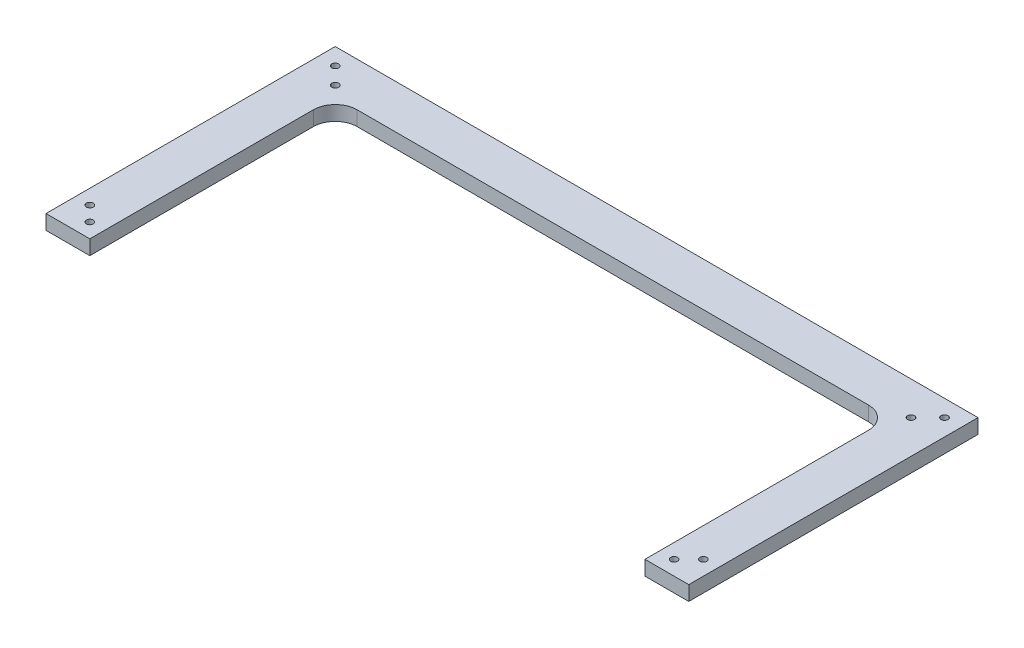
ISO-10303-21;
HEADER;
FILE_DESCRIPTION(('STEP AP214'),'2;1');
FILE_NAME('part.step','',(''),(''),'','','');
FILE_SCHEMA(('AUTOMOTIVE_DESIGN { 1 0 10303 214 1 1 1 1 }'));
ENDSEC;
DATA;
#1=APPLICATION_CONTEXT('core data for automotive mechanical design processes');
#2=APPLICATION_PROTOCOL_DEFINITION('international standard','automotive_design',2000,#1);
#3=PRODUCT_CONTEXT('',#1,'mechanical');
#4=PRODUCT('Part','Part','',(#3));
#5=PRODUCT_RELATED_PRODUCT_CATEGORY('part','',(#4));
#6=PRODUCT_DEFINITION_FORMATION('','',#4);
#7=PRODUCT_DEFINITION_CONTEXT('part definition',#1,'design');
#8=PRODUCT_DEFINITION('design','',#6,#7);
#9=PRODUCT_DEFINITION_SHAPE('','',#8);
#10=(LENGTH_UNIT() NAMED_UNIT(*) SI_UNIT(.MILLI.,.METRE.));
#11=(NAMED_UNIT(*) PLANE_ANGLE_UNIT() SI_UNIT($,.RADIAN.));
#12=(NAMED_UNIT(*) SI_UNIT($,.STERADIAN.) SOLID_ANGLE_UNIT());
#13=UNCERTAINTY_MEASURE_WITH_UNIT(LENGTH_MEASURE(1.E-05),#10,'distance_accuracy_value','');
#14=(GEOMETRIC_REPRESENTATION_CONTEXT(3) GLOBAL_UNCERTAINTY_ASSIGNED_CONTEXT((#13)) GLOBAL_UNIT_ASSIGNED_CONTEXT((#10,
#11,#12)) REPRESENTATION_CONTEXT('',''));
#15=CARTESIAN_POINT('',(0.,0.,0.));
#16=DIRECTION('',(0.,0.,1.));
#17=DIRECTION('',(1.,0.,0.));
#18=AXIS2_PLACEMENT_3D('',#15,#16,#17);
#19=CARTESIAN_POINT('',(-139.7,-6.35,62.865));
#20=DIRECTION('',(0.,0.,1.));
#21=DIRECTION('',(1.,0.,0.));
#22=AXIS2_PLACEMENT_3D('',#19,#20,#21);
#23=PLANE('',#22);
#24=DIRECTION('',(1.,0.,0.));
#25=VECTOR('',#24,1.);
#26=CARTESIAN_POINT('',(-139.7,0.,62.865));
#27=LINE('',#26,#25);
#28=CARTESIAN_POINT('',(-139.7,0.,62.865));
#29=VERTEX_POINT('',#28);
#30=CARTESIAN_POINT('',(-120.65,0.,62.865));
#31=VERTEX_POINT('',#30);
#32=EDGE_CURVE('E167',#29,#31,#27,.T.);
#33=ORIENTED_EDGE('',*,*,#32,.F.);
#34=DIRECTION('',(0.,1.,0.));
#35=VECTOR('',#34,1.);
#36=CARTESIAN_POINT('',(-139.7,-6.35,62.865));
#37=LINE('',#36,#35);
#38=CARTESIAN_POINT('',(-139.7,-6.35,62.865));
#39=VERTEX_POINT('',#38);
#40=EDGE_CURVE('E135',#39,#29,#37,.T.);
#41=ORIENTED_EDGE('',*,*,#40,.F.);
#42=DIRECTION('',(1.,0.,0.));
#43=VECTOR('',#42,1.);
#44=CARTESIAN_POINT('',(-139.7,-6.35,62.865));
#45=LINE('',#44,#43);
#46=CARTESIAN_POINT('',(-120.65,-6.35,62.865));
#47=VERTEX_POINT('',#46);
#48=EDGE_CURVE('E131',#39,#47,#45,.T.);
#49=ORIENTED_EDGE('',*,*,#48,.T.);
#50=DIRECTION('',(0.,1.,0.));
#51=VECTOR('',#50,1.);
#52=CARTESIAN_POINT('',(-120.65,-6.35,62.865));
#53=LINE('',#52,#51);
#54=EDGE_CURVE('E116',#47,#31,#53,.T.);
#55=ORIENTED_EDGE('',*,*,#54,.T.);
#56=EDGE_LOOP('',(#33,#41,#49,#55));
#57=FACE_BOUND('',#56,.T.);
#58=ADVANCED_FACE('F39',(#57),#23,.T.);
#59=CARTESIAN_POINT('',(-139.7,-6.35,62.865));
#60=DIRECTION('',(1.,0.,0.));
#61=DIRECTION('',(0.,0.,-1.));
#62=AXIS2_PLACEMENT_3D('',#59,#60,#61);
#63=PLANE('',#62);
#64=DIRECTION('',(0.,0.,-1.));
#65=VECTOR('',#64,1.);
#66=CARTESIAN_POINT('',(-139.7,0.,62.865));
#67=LINE('',#66,#65);
#68=CARTESIAN_POINT('',(-139.7,0.,-62.865));
#69=VERTEX_POINT('',#68);
#70=EDGE_CURVE('E138',#29,#69,#67,.T.);
#71=ORIENTED_EDGE('',*,*,#70,.T.);
#72=DIRECTION('',(0.,1.,0.));
#73=VECTOR('',#72,1.);
#74=CARTESIAN_POINT('',(-139.7,-6.35,-62.865));
#75=LINE('',#74,#73);
#76=CARTESIAN_POINT('',(-139.7,-6.35,-62.865));
#77=VERTEX_POINT('',#76);
#78=EDGE_CURVE('E195',#77,#69,#75,.T.);
#79=ORIENTED_EDGE('',*,*,#78,.F.);
#80=DIRECTION('',(0.,0.,-1.));
#81=VECTOR('',#80,1.);
#82=CARTESIAN_POINT('',(-139.7,-6.35,62.865));
#83=LINE('',#82,#81);
#84=EDGE_CURVE('E127',#39,#77,#83,.T.);
#85=ORIENTED_EDGE('',*,*,#84,.F.);
#86=ORIENTED_EDGE('',*,*,#40,.T.);
#87=EDGE_LOOP('',(#71,#79,#85,#86));
#88=FACE_BOUND('',#87,.T.);
#89=ADVANCED_FACE('F243',(#88),#63,.F.);
#90=CARTESIAN_POINT('',(-139.7,-6.35,-62.865));
#91=DIRECTION('',(0.,0.,1.));
#92=DIRECTION('',(1.,0.,0.));
#93=AXIS2_PLACEMENT_3D('',#90,#91,#92);
#94=PLANE('',#93);
#95=DIRECTION('',(1.,0.,0.));
#96=VECTOR('',#95,1.);
#97=CARTESIAN_POINT('',(-139.7,0.,-62.865));
#98=LINE('',#97,#96);
#99=CARTESIAN_POINT('',(139.7,0.,-62.865));
#100=VERTEX_POINT('',#99);
#101=EDGE_CURVE('E141',#69,#100,#98,.T.);
#102=ORIENTED_EDGE('',*,*,#101,.T.);
#103=DIRECTION('',(0.,1.,0.));
#104=VECTOR('',#103,1.);
#105=CARTESIAN_POINT('',(139.7,-6.35,-62.865));
#106=LINE('',#105,#104);
#107=CARTESIAN_POINT('',(139.7,-6.35,-62.865));
#108=VERTEX_POINT('',#107);
#109=EDGE_CURVE('E199',#108,#100,#106,.T.);
#110=ORIENTED_EDGE('',*,*,#109,.F.);
#111=DIRECTION('',(1.,0.,0.));
#112=VECTOR('',#111,1.);
#113=CARTESIAN_POINT('',(-139.7,-6.35,-62.865));
#114=LINE('',#113,#112);
#115=EDGE_CURVE('E162',#77,#108,#114,.T.);
#116=ORIENTED_EDGE('',*,*,#115,.F.);
#117=ORIENTED_EDGE('',*,*,#78,.T.);
#118=EDGE_LOOP('',(#102,#110,#116,#117));
#119=FACE_BOUND('',#118,.T.);
#120=ADVANCED_FACE('F248',(#119),#94,.F.);
#121=CARTESIAN_POINT('',(139.7,-6.35,62.865));
#122=DIRECTION('',(1.,0.,0.));
#123=DIRECTION('',(0.,0.,-1.));
#124=AXIS2_PLACEMENT_3D('',#121,#122,#123);
#125=PLANE('',#124);
#126=DIRECTION('',(0.,0.,-1.));
#127=VECTOR('',#126,1.);
#128=CARTESIAN_POINT('',(139.7,0.,62.865));
#129=LINE('',#128,#127);
#130=CARTESIAN_POINT('',(139.7,0.,62.865));
#131=VERTEX_POINT('',#130);
#132=EDGE_CURVE('E185',#131,#100,#129,.T.);
#133=ORIENTED_EDGE('',*,*,#132,.F.);
#134=DIRECTION('',(0.,1.,0.));
#135=VECTOR('',#134,1.);
#136=CARTESIAN_POINT('',(139.7,-6.35,62.865));
#137=LINE('',#136,#135);
#138=CARTESIAN_POINT('',(139.7,-6.35,62.865));
#139=VERTEX_POINT('',#138);
#140=EDGE_CURVE('E202',#139,#131,#137,.T.);
#141=ORIENTED_EDGE('',*,*,#140,.F.);
#142=DIRECTION('',(0.,0.,-1.));
#143=VECTOR('',#142,1.);
#144=CARTESIAN_POINT('',(139.7,-6.35,62.865));
#145=LINE('',#144,#143);
#146=EDGE_CURVE('E158',#139,#108,#145,.T.);
#147=ORIENTED_EDGE('',*,*,#146,.T.);
#148=ORIENTED_EDGE('',*,*,#109,.T.);
#149=EDGE_LOOP('',(#133,#141,#147,#148));
#150=FACE_BOUND('',#149,.T.);
#151=ADVANCED_FACE('F263',(#150),#125,.T.);
#152=CARTESIAN_POINT('',(120.65,-6.35,62.865));
#153=DIRECTION('',(0.,0.,1.));
#154=DIRECTION('',(1.,0.,0.));
#155=AXIS2_PLACEMENT_3D('',#152,#153,#154);
#156=PLANE('',#155);
#157=DIRECTION('',(1.,0.,0.));
#158=VECTOR('',#157,1.);
#159=CARTESIAN_POINT('',(120.65,0.,62.865));
#160=LINE('',#159,#158);
#161=CARTESIAN_POINT('',(120.65,0.,62.865));
#162=VERTEX_POINT('',#161);
#163=EDGE_CURVE('E181',#162,#131,#160,.T.);
#164=ORIENTED_EDGE('',*,*,#163,.F.);
#165=DIRECTION('',(0.,1.,0.));
#166=VECTOR('',#165,1.);
#167=CARTESIAN_POINT('',(120.65,-6.35,62.865));
#168=LINE('',#167,#166);
#169=CARTESIAN_POINT('',(120.65,-6.35,62.865));
#170=VERTEX_POINT('',#169);
#171=EDGE_CURVE('E126',#170,#162,#168,.T.);
#172=ORIENTED_EDGE('',*,*,#171,.F.);
#173=DIRECTION('',(1.,0.,0.));
#174=VECTOR('',#173,1.);
#175=CARTESIAN_POINT('',(120.65,-6.35,62.865));
#176=LINE('',#175,#174);
#177=EDGE_CURVE('E154',#170,#139,#176,.T.);
#178=ORIENTED_EDGE('',*,*,#177,.T.);
#179=ORIENTED_EDGE('',*,*,#140,.T.);
#180=EDGE_LOOP('',(#164,#172,#178,#179));
#181=FACE_BOUND('',#180,.T.);
#182=ADVANCED_FACE('F259',(#181),#156,.T.);
#183=CARTESIAN_POINT('',(120.65,-6.35,62.865));
#184=DIRECTION('',(1.,0.,0.));
#185=DIRECTION('',(0.,0.,-1.));
#186=AXIS2_PLACEMENT_3D('',#183,#184,#185);
#187=PLANE('',#186);
#188=DIRECTION('',(0.,0.,-1.));
#189=VECTOR('',#188,1.);
#190=CARTESIAN_POINT('',(120.65,0.,62.865));
#191=LINE('',#190,#189);
#192=CARTESIAN_POINT('',(120.65,0.,-34.29));
#193=VERTEX_POINT('',#192);
#194=EDGE_CURVE('E177',#162,#193,#191,.T.);
#195=ORIENTED_EDGE('',*,*,#194,.T.);
#196=DIRECTION('',(0.,1.,0.));
#197=VECTOR('',#196,1.);
#198=CARTESIAN_POINT('',(120.65,-6.35,-34.29));
#199=LINE('',#198,#197);
#200=CARTESIAN_POINT('',(120.65,-6.35,-34.29));
#201=VERTEX_POINT('',#200);
#202=EDGE_CURVE('E213',#193,#201,#199,.F.);
#203=ORIENTED_EDGE('',*,*,#202,.T.);
#204=DIRECTION('',(0.,0.,-1.));
#205=VECTOR('',#204,1.);
#206=CARTESIAN_POINT('',(120.65,-6.35,62.865));
#207=LINE('',#206,#205);
#208=EDGE_CURVE('E150',#170,#201,#207,.T.);
#209=ORIENTED_EDGE('',*,*,#208,.F.);
#210=ORIENTED_EDGE('',*,*,#171,.T.);
#211=EDGE_LOOP('',(#195,#203,#209,#210));
#212=FACE_BOUND('',#211,.T.);
#213=ADVANCED_FACE('F256',(#212),#187,.F.);
#214=CARTESIAN_POINT('',(-120.65,-6.35,-43.815));
#215=DIRECTION('',(0.,0.,1.));
#216=DIRECTION('',(1.,0.,0.));
#217=AXIS2_PLACEMENT_3D('',#214,#215,#216);
#218=PLANE('',#217);
#219=DIRECTION('',(1.,0.,0.));
#220=VECTOR('',#219,1.);
#221=CARTESIAN_POINT('',(-120.65,-6.35,-43.815));
#222=LINE('',#221,#220);
#223=CARTESIAN_POINT('',(-111.125,-6.35,-43.815));
#224=VERTEX_POINT('',#223);
#225=CARTESIAN_POINT('',(111.125,-6.35,-43.815));
#226=VERTEX_POINT('',#225);
#227=EDGE_CURVE('E133',#224,#226,#222,.T.);
#228=ORIENTED_EDGE('',*,*,#227,.T.);
#229=DIRECTION('',(0.,1.,0.));
#230=VECTOR('',#229,1.);
#231=CARTESIAN_POINT('',(111.125,-6.35,-43.815));
#232=LINE('',#231,#230);
#233=CARTESIAN_POINT('',(111.125,0.,-43.815));
#234=VERTEX_POINT('',#233);
#235=EDGE_CURVE('E209',#226,#234,#232,.T.);
#236=ORIENTED_EDGE('',*,*,#235,.T.);
#237=DIRECTION('',(1.,0.,0.));
#238=VECTOR('',#237,1.);
#239=CARTESIAN_POINT('',(-120.65,0.,-43.815));
#240=LINE('',#239,#238);
#241=CARTESIAN_POINT('',(-111.125,0.,-43.815));
#242=VERTEX_POINT('',#241);
#243=EDGE_CURVE('E173',#242,#234,#240,.T.);
#244=ORIENTED_EDGE('',*,*,#243,.F.);
#245=DIRECTION('',(0.,1.,0.));
#246=VECTOR('',#245,1.);
#247=CARTESIAN_POINT('',(-111.125,-6.35,-43.815));
#248=LINE('',#247,#246);
#249=EDGE_CURVE('E194',#242,#224,#248,.F.);
#250=ORIENTED_EDGE('',*,*,#249,.T.);
#251=EDGE_LOOP('',(#228,#236,#244,#250));
#252=FACE_BOUND('',#251,.T.);
#253=ADVANCED_FACE('F229',(#252),#218,.T.);
#254=CARTESIAN_POINT('',(-120.65,-6.35,62.865));
#255=DIRECTION('',(1.,0.,0.));
#256=DIRECTION('',(0.,0.,-1.));
#257=AXIS2_PLACEMENT_3D('',#254,#255,#256);
#258=PLANE('',#257);
#259=DIRECTION('',(0.,0.,-1.));
#260=VECTOR('',#259,1.);
#261=CARTESIAN_POINT('',(-120.65,-6.35,62.865));
#262=LINE('',#261,#260);
#263=CARTESIAN_POINT('',(-120.65,-6.35,-34.29));
#264=VERTEX_POINT('',#263);
#265=EDGE_CURVE('E118',#47,#264,#262,.T.);
#266=ORIENTED_EDGE('',*,*,#265,.T.);
#267=DIRECTION('',(0.,1.,0.));
#268=VECTOR('',#267,1.);
#269=CARTESIAN_POINT('',(-120.65,0.,-34.29));
#270=LINE('',#269,#268);
#271=CARTESIAN_POINT('',(-120.65,0.,-34.29));
#272=VERTEX_POINT('',#271);
#273=EDGE_CURVE('E216',#264,#272,#270,.T.);
#274=ORIENTED_EDGE('',*,*,#273,.T.);
#275=DIRECTION('',(0.,0.,-1.));
#276=VECTOR('',#275,1.);
#277=CARTESIAN_POINT('',(-120.65,0.,62.865));
#278=LINE('',#277,#276);
#279=EDGE_CURVE('E120',#31,#272,#278,.T.);
#280=ORIENTED_EDGE('',*,*,#279,.F.);
#281=ORIENTED_EDGE('',*,*,#54,.F.);
#282=EDGE_LOOP('',(#266,#274,#280,#281));
#283=FACE_BOUND('',#282,.T.);
#284=ADVANCED_FACE('F117',(#283),#258,.T.);
#285=CARTESIAN_POINT('',(0.,-6.35,0.));
#286=DIRECTION('',(0.,1.,0.));
#287=DIRECTION('',(0.,0.,1.));
#288=AXIS2_PLACEMENT_3D('',#285,#286,#287);
#289=PLANE('',#288);
#290=CARTESIAN_POINT('',(125.140128060535,-6.35,-48.3051280605346));
#291=DIRECTION('',(0.,1.,0.));
#292=DIRECTION('',(0.,0.,-1.));
#293=AXIS2_PLACEMENT_3D('',#290,#291,#292);
#294=CIRCLE('',#293,1.5);
#295=CARTESIAN_POINT('',(125.140128060535,-6.35,-49.8051280605346));
#296=VERTEX_POINT('',#295);
#297=EDGE_CURVE('E344',#296,#296,#294,.T.);
#298=ORIENTED_EDGE('',*,*,#297,.T.);
#299=EDGE_LOOP('',(#298));
#300=FACE_BOUND('',#299,.T.);
#301=CARTESIAN_POINT('',(-125.140128060535,-6.35,-48.3051280605346));
#302=DIRECTION('',(0.,1.,0.));
#303=DIRECTION('',(0.,0.,1.));
#304=AXIS2_PLACEMENT_3D('',#301,#302,#303);
#305=CIRCLE('',#304,1.5);
#306=CARTESIAN_POINT('',(-125.140128060535,-6.35,-46.8051280605346));
#307=VERTEX_POINT('',#306);
#308=EDGE_CURVE('E335',#307,#307,#305,.T.);
#309=ORIENTED_EDGE('',*,*,#308,.T.);
#310=EDGE_LOOP('',(#309));
#311=FACE_BOUND('',#310,.T.);
#312=CARTESIAN_POINT('',(-132.420064030267,-6.35,-55.5850640302673));
#313=DIRECTION('',(0.,1.,0.));
#314=DIRECTION('',(0.,0.,1.));
#315=AXIS2_PLACEMENT_3D('',#312,#313,#314);
#316=CIRCLE('',#315,1.5);
#317=CARTESIAN_POINT('',(-132.420064030267,-6.35,-54.0850640302673));
#318=VERTEX_POINT('',#317);
#319=EDGE_CURVE('E359',#318,#318,#316,.T.);
#320=ORIENTED_EDGE('',*,*,#319,.T.);
#321=EDGE_LOOP('',(#320));
#322=FACE_BOUND('',#321,.T.);
#323=CARTESIAN_POINT('',(-127.,-6.35,56.515));
#324=DIRECTION('',(0.,1.,0.));
#325=DIRECTION('',(0.,0.,1.));
#326=AXIS2_PLACEMENT_3D('',#323,#324,#325);
#327=CIRCLE('',#326,1.5);
#328=CARTESIAN_POINT('',(-127.,-6.35,58.015));
#329=VERTEX_POINT('',#328);
#330=EDGE_CURVE('E351',#329,#329,#327,.T.);
#331=ORIENTED_EDGE('',*,*,#330,.T.);
#332=EDGE_LOOP('',(#331));
#333=FACE_BOUND('',#332,.T.);
#334=CARTESIAN_POINT('',(133.35,-6.35,50.1649999999999));
#335=DIRECTION('',(0.,1.,0.));
#336=DIRECTION('',(0.,0.,-1.));
#337=AXIS2_PLACEMENT_3D('',#334,#335,#336);
#338=CIRCLE('',#337,1.5);
#339=CARTESIAN_POINT('',(133.35,-6.35,48.665));
#340=VERTEX_POINT('',#339);
#341=EDGE_CURVE('E308',#340,#340,#338,.T.);
#342=ORIENTED_EDGE('',*,*,#341,.T.);
#343=EDGE_LOOP('',(#342));
#344=FACE_BOUND('',#343,.T.);
#345=CARTESIAN_POINT('',(127.,-6.35,56.5149999999999));
#346=DIRECTION('',(0.,1.,0.));
#347=DIRECTION('',(0.,0.,-1.));
#348=AXIS2_PLACEMENT_3D('',#345,#346,#347);
#349=CIRCLE('',#348,1.5);
#350=CARTESIAN_POINT('',(127.,-6.35,55.015));
#351=VERTEX_POINT('',#350);
#352=EDGE_CURVE('E328',#351,#351,#349,.T.);
#353=ORIENTED_EDGE('',*,*,#352,.T.);
#354=EDGE_LOOP('',(#353));
#355=FACE_BOUND('',#354,.T.);
#356=CARTESIAN_POINT('',(132.420064030267,-6.35,-55.5850640302673));
#357=DIRECTION('',(0.,1.,0.));
#358=DIRECTION('',(0.,0.,-1.));
#359=AXIS2_PLACEMENT_3D('',#356,#357,#358);
#360=CIRCLE('',#359,1.5);
#361=CARTESIAN_POINT('',(132.420064030267,-6.35,-57.0850640302673));
#362=VERTEX_POINT('',#361);
#363=EDGE_CURVE('E319',#362,#362,#360,.T.);
#364=ORIENTED_EDGE('',*,*,#363,.T.);
#365=EDGE_LOOP('',(#364));
#366=FACE_BOUND('',#365,.T.);
#367=CARTESIAN_POINT('',(-133.35,-6.35,50.165));
#368=DIRECTION('',(0.,1.,0.));
#369=DIRECTION('',(0.,0.,1.));
#370=AXIS2_PLACEMENT_3D('',#367,#368,#369);
#371=CIRCLE('',#370,1.5);
#372=CARTESIAN_POINT('',(-133.35,-6.35,51.665));
#373=VERTEX_POINT('',#372);
#374=EDGE_CURVE('E170',#373,#373,#371,.T.);
#375=ORIENTED_EDGE('',*,*,#374,.T.);
#376=EDGE_LOOP('',(#375));
#377=FACE_BOUND('',#376,.T.);
#378=ORIENTED_EDGE('',*,*,#48,.F.);
#379=ORIENTED_EDGE('',*,*,#84,.T.);
#380=ORIENTED_EDGE('',*,*,#115,.T.);
#381=ORIENTED_EDGE('',*,*,#146,.F.);
#382=ORIENTED_EDGE('',*,*,#177,.F.);
#383=ORIENTED_EDGE('',*,*,#208,.T.);
#384=CARTESIAN_POINT('',(111.125,-6.35,-34.29));
#385=DIRECTION('',(0.,1.,0.));
#386=DIRECTION('',(0.,0.,1.));
#387=AXIS2_PLACEMENT_3D('',#384,#385,#386);
#388=CIRCLE('',#387,9.525);
#389=EDGE_CURVE('E222',#201,#226,#388,.T.);
#390=ORIENTED_EDGE('',*,*,#389,.T.);
#391=ORIENTED_EDGE('',*,*,#227,.F.);
#392=CARTESIAN_POINT('',(-111.125,-6.35,-34.29));
#393=DIRECTION('',(0.,1.,0.));
#394=DIRECTION('',(0.,0.,1.));
#395=AXIS2_PLACEMENT_3D('',#392,#393,#394);
#396=CIRCLE('',#395,9.525);
#397=EDGE_CURVE('E11',#224,#264,#396,.T.);
#398=ORIENTED_EDGE('',*,*,#397,.T.);
#399=ORIENTED_EDGE('',*,*,#265,.F.);
#400=EDGE_LOOP('',(#378,#379,#380,#381,#382,#383,#390,#391,#398,#399));
#401=FACE_BOUND('',#400,.T.);
#402=ADVANCED_FACE('F130',(#300,#311,#322,#333,#344,#355,#366,#377,#401),#289,.F.);
#403=CARTESIAN_POINT('',(0.,0.,0.));
#404=DIRECTION('',(0.,1.,0.));
#405=DIRECTION('',(0.,0.,1.));
#406=AXIS2_PLACEMENT_3D('',#403,#404,#405);
#407=PLANE('',#406);
#408=CARTESIAN_POINT('',(125.140128060535,0.,-48.3051280605346));
#409=DIRECTION('',(0.,1.,0.));
#410=DIRECTION('',(0.,0.,-1.));
#411=AXIS2_PLACEMENT_3D('',#408,#409,#410);
#412=CIRCLE('',#411,1.5);
#413=CARTESIAN_POINT('',(125.140128060535,0.,-49.8051280605346));
#414=VERTEX_POINT('',#413);
#415=EDGE_CURVE('E323',#414,#414,#412,.T.);
#416=ORIENTED_EDGE('',*,*,#415,.F.);
#417=EDGE_LOOP('',(#416));
#418=FACE_BOUND('',#417,.T.);
#419=CARTESIAN_POINT('',(-125.140128060535,0.,-48.3051280605346));
#420=DIRECTION('',(0.,1.,0.));
#421=DIRECTION('',(0.,0.,1.));
#422=AXIS2_PLACEMENT_3D('',#419,#420,#421);
#423=CIRCLE('',#422,1.5);
#424=CARTESIAN_POINT('',(-125.140128060535,0.,-46.8051280605346));
#425=VERTEX_POINT('',#424);
#426=EDGE_CURVE('E340',#425,#425,#423,.T.);
#427=ORIENTED_EDGE('',*,*,#426,.F.);
#428=EDGE_LOOP('',(#427));
#429=FACE_BOUND('',#428,.T.);
#430=CARTESIAN_POINT('',(-132.420064030267,0.,-55.5850640302673));
#431=DIRECTION('',(0.,1.,0.));
#432=DIRECTION('',(0.,0.,1.));
#433=AXIS2_PLACEMENT_3D('',#430,#431,#432);
#434=CIRCLE('',#433,1.5);
#435=CARTESIAN_POINT('',(-132.420064030267,0.,-54.0850640302673));
#436=VERTEX_POINT('',#435);
#437=EDGE_CURVE('E339',#436,#436,#434,.T.);
#438=ORIENTED_EDGE('',*,*,#437,.F.);
#439=EDGE_LOOP('',(#438));
#440=FACE_BOUND('',#439,.T.);
#441=CARTESIAN_POINT('',(-127.,0.,56.515));
#442=DIRECTION('',(0.,1.,0.));
#443=DIRECTION('',(0.,0.,1.));
#444=AXIS2_PLACEMENT_3D('',#441,#442,#443);
#445=CIRCLE('',#444,1.5);
#446=CARTESIAN_POINT('',(-127.,0.,58.015));
#447=VERTEX_POINT('',#446);
#448=EDGE_CURVE('E355',#447,#447,#445,.T.);
#449=ORIENTED_EDGE('',*,*,#448,.F.);
#450=EDGE_LOOP('',(#449));
#451=FACE_BOUND('',#450,.T.);
#452=CARTESIAN_POINT('',(133.35,0.,50.1649999999999));
#453=DIRECTION('',(0.,1.,0.));
#454=DIRECTION('',(0.,0.,-1.));
#455=AXIS2_PLACEMENT_3D('',#452,#453,#454);
#456=CIRCLE('',#455,1.5);
#457=CARTESIAN_POINT('',(133.35,0.,48.665));
#458=VERTEX_POINT('',#457);
#459=EDGE_CURVE('E311',#458,#458,#456,.T.);
#460=ORIENTED_EDGE('',*,*,#459,.F.);
#461=EDGE_LOOP('',(#460));
#462=FACE_BOUND('',#461,.T.);
#463=CARTESIAN_POINT('',(127.,0.,56.5149999999999));
#464=DIRECTION('',(0.,1.,0.));
#465=DIRECTION('',(0.,0.,-1.));
#466=AXIS2_PLACEMENT_3D('',#463,#464,#465);
#467=CIRCLE('',#466,1.5);
#468=CARTESIAN_POINT('',(127.,0.,55.015));
#469=VERTEX_POINT('',#468);
#470=EDGE_CURVE('E316',#469,#469,#467,.T.);
#471=ORIENTED_EDGE('',*,*,#470,.F.);
#472=EDGE_LOOP('',(#471));
#473=FACE_BOUND('',#472,.T.);
#474=CARTESIAN_POINT('',(132.420064030267,0.,-55.5850640302673));
#475=DIRECTION('',(0.,1.,0.));
#476=DIRECTION('',(0.,0.,-1.));
#477=AXIS2_PLACEMENT_3D('',#474,#475,#476);
#478=CIRCLE('',#477,1.5);
#479=CARTESIAN_POINT('',(132.420064030267,0.,-57.0850640302673));
#480=VERTEX_POINT('',#479);
#481=EDGE_CURVE('E324',#480,#480,#478,.T.);
#482=ORIENTED_EDGE('',*,*,#481,.F.);
#483=EDGE_LOOP('',(#482));
#484=FACE_BOUND('',#483,.T.);
#485=CARTESIAN_POINT('',(-133.35,0.,50.165));
#486=DIRECTION('',(0.,1.,0.));
#487=DIRECTION('',(0.,0.,1.));
#488=AXIS2_PLACEMENT_3D('',#485,#486,#487);
#489=CIRCLE('',#488,1.5);
#490=CARTESIAN_POINT('',(-133.35,0.,51.665));
#491=VERTEX_POINT('',#490);
#492=EDGE_CURVE('E144',#491,#491,#489,.T.);
#493=ORIENTED_EDGE('',*,*,#492,.F.);
#494=EDGE_LOOP('',(#493));
#495=FACE_BOUND('',#494,.T.);
#496=ORIENTED_EDGE('',*,*,#32,.T.);
#497=ORIENTED_EDGE('',*,*,#279,.T.);
#498=CARTESIAN_POINT('',(-111.125,0.,-34.29));
#499=DIRECTION('',(0.,1.,0.));
#500=DIRECTION('',(0.,0.,1.));
#501=AXIS2_PLACEMENT_3D('',#498,#499,#500);
#502=CIRCLE('',#501,9.525);
#503=EDGE_CURVE('E48',#272,#242,#502,.F.);
#504=ORIENTED_EDGE('',*,*,#503,.T.);
#505=ORIENTED_EDGE('',*,*,#243,.T.);
#506=CARTESIAN_POINT('',(111.125,0.,-34.29));
#507=DIRECTION('',(0.,1.,0.));
#508=DIRECTION('',(0.,0.,1.));
#509=AXIS2_PLACEMENT_3D('',#506,#507,#508);
#510=CIRCLE('',#509,9.525);
#511=EDGE_CURVE('E219',#234,#193,#510,.F.);
#512=ORIENTED_EDGE('',*,*,#511,.T.);
#513=ORIENTED_EDGE('',*,*,#194,.F.);
#514=ORIENTED_EDGE('',*,*,#163,.T.);
#515=ORIENTED_EDGE('',*,*,#132,.T.);
#516=ORIENTED_EDGE('',*,*,#101,.F.);
#517=ORIENTED_EDGE('',*,*,#70,.F.);
#518=EDGE_LOOP('',(#496,#497,#504,#505,#512,#513,#514,#515,#516,#517));
#519=FACE_BOUND('',#518,.T.);
#520=ADVANCED_FACE('F227',(#418,#429,#440,#451,#462,#473,#484,#495,#519),#407,.T.);
#521=CARTESIAN_POINT('',(111.125,-6.35,-34.29));
#522=DIRECTION('',(0.,1.,0.));
#523=DIRECTION('',(0.,0.,1.));
#524=AXIS2_PLACEMENT_3D('',#521,#522,#523);
#525=CYLINDRICAL_SURFACE('',#524,9.525);
#526=ORIENTED_EDGE('',*,*,#389,.F.);
#527=ORIENTED_EDGE('',*,*,#202,.F.);
#528=ORIENTED_EDGE('',*,*,#511,.F.);
#529=ORIENTED_EDGE('',*,*,#235,.F.);
#530=EDGE_LOOP('',(#526,#527,#528,#529));
#531=FACE_BOUND('',#530,.T.);
#532=ADVANCED_FACE('F233',(#531),#525,.F.);
#533=CARTESIAN_POINT('',(-111.125,-6.35,-34.29));
#534=DIRECTION('',(0.,-1.,0.));
#535=DIRECTION('',(0.,0.,-1.));
#536=AXIS2_PLACEMENT_3D('',#533,#534,#535);
#537=CYLINDRICAL_SURFACE('',#536,9.525);
#538=ORIENTED_EDGE('',*,*,#397,.F.);
#539=ORIENTED_EDGE('',*,*,#249,.F.);
#540=ORIENTED_EDGE('',*,*,#503,.F.);
#541=ORIENTED_EDGE('',*,*,#273,.F.);
#542=EDGE_LOOP('',(#538,#539,#540,#541));
#543=FACE_BOUND('',#542,.T.);
#544=ADVANCED_FACE('F41',(#543),#537,.F.);
#545=CARTESIAN_POINT('',(-133.35,-6.35,50.165));
#546=DIRECTION('',(0.,1.,0.));
#547=DIRECTION('',(0.,0.,1.));
#548=AXIS2_PLACEMENT_3D('',#545,#546,#547);
#549=CYLINDRICAL_SURFACE('',#548,1.5);
#550=ORIENTED_EDGE('',*,*,#374,.F.);
#551=EDGE_LOOP('',(#550));
#552=FACE_BOUND('',#551,.T.);
#553=ORIENTED_EDGE('',*,*,#492,.T.);
#554=EDGE_LOOP('',(#553));
#555=FACE_BOUND('',#554,.T.);
#556=ADVANCED_FACE('F232',(#552,#555),#549,.F.);
#557=CARTESIAN_POINT('',(132.420064030267,-6.35,-55.5850640302673));
#558=DIRECTION('',(0.,1.,0.));
#559=DIRECTION('',(0.,0.,1.));
#560=AXIS2_PLACEMENT_3D('',#557,#558,#559);
#561=CYLINDRICAL_SURFACE('',#560,1.5);
#562=ORIENTED_EDGE('',*,*,#363,.F.);
#563=EDGE_LOOP('',(#562));
#564=FACE_BOUND('',#563,.T.);
#565=ORIENTED_EDGE('',*,*,#481,.T.);
#566=EDGE_LOOP('',(#565));
#567=FACE_BOUND('',#566,.T.);
#568=ADVANCED_FACE('F238',(#564,#567),#561,.F.);
#569=CARTESIAN_POINT('',(127.,-6.35,56.5149999999999));
#570=DIRECTION('',(0.,1.,0.));
#571=DIRECTION('',(0.,0.,1.));
#572=AXIS2_PLACEMENT_3D('',#569,#570,#571);
#573=CYLINDRICAL_SURFACE('',#572,1.5);
#574=ORIENTED_EDGE('',*,*,#352,.F.);
#575=EDGE_LOOP('',(#574));
#576=FACE_BOUND('',#575,.T.);
#577=ORIENTED_EDGE('',*,*,#470,.T.);
#578=EDGE_LOOP('',(#577));
#579=FACE_BOUND('',#578,.T.);
#580=ADVANCED_FACE('F294',(#576,#579),#573,.F.);
#581=CARTESIAN_POINT('',(133.35,-6.35,50.1649999999999));
#582=DIRECTION('',(0.,1.,0.));
#583=DIRECTION('',(0.,0.,1.));
#584=AXIS2_PLACEMENT_3D('',#581,#582,#583);
#585=CYLINDRICAL_SURFACE('',#584,1.5);
#586=ORIENTED_EDGE('',*,*,#341,.F.);
#587=EDGE_LOOP('',(#586));
#588=FACE_BOUND('',#587,.T.);
#589=ORIENTED_EDGE('',*,*,#459,.T.);
#590=EDGE_LOOP('',(#589));
#591=FACE_BOUND('',#590,.T.);
#592=ADVANCED_FACE('F285',(#588,#591),#585,.F.);
#593=CARTESIAN_POINT('',(-127.,-6.35,56.515));
#594=DIRECTION('',(0.,1.,0.));
#595=DIRECTION('',(0.,0.,1.));
#596=AXIS2_PLACEMENT_3D('',#593,#594,#595);
#597=CYLINDRICAL_SURFACE('',#596,1.5);
#598=ORIENTED_EDGE('',*,*,#330,.F.);
#599=EDGE_LOOP('',(#598));
#600=FACE_BOUND('',#599,.T.);
#601=ORIENTED_EDGE('',*,*,#448,.T.);
#602=EDGE_LOOP('',(#601));
#603=FACE_BOUND('',#602,.T.);
#604=ADVANCED_FACE('F281',(#600,#603),#597,.F.);
#605=CARTESIAN_POINT('',(-132.420064030267,-6.35,-55.5850640302673));
#606=DIRECTION('',(0.,1.,0.));
#607=DIRECTION('',(0.,0.,1.));
#608=AXIS2_PLACEMENT_3D('',#605,#606,#607);
#609=CYLINDRICAL_SURFACE('',#608,1.5);
#610=ORIENTED_EDGE('',*,*,#319,.F.);
#611=EDGE_LOOP('',(#610));
#612=FACE_BOUND('',#611,.T.);
#613=ORIENTED_EDGE('',*,*,#437,.T.);
#614=EDGE_LOOP('',(#613));
#615=FACE_BOUND('',#614,.T.);
#616=ADVANCED_FACE('F277',(#612,#615),#609,.F.);
#617=CARTESIAN_POINT('',(-125.140128060535,-6.35,-48.3051280605346));
#618=DIRECTION('',(0.,1.,0.));
#619=DIRECTION('',(0.,0.,1.));
#620=AXIS2_PLACEMENT_3D('',#617,#618,#619);
#621=CYLINDRICAL_SURFACE('',#620,1.5);
#622=ORIENTED_EDGE('',*,*,#308,.F.);
#623=EDGE_LOOP('',(#622));
#624=FACE_BOUND('',#623,.T.);
#625=ORIENTED_EDGE('',*,*,#426,.T.);
#626=EDGE_LOOP('',(#625));
#627=FACE_BOUND('',#626,.T.);
#628=ADVANCED_FACE('F280',(#624,#627),#621,.F.);
#629=CARTESIAN_POINT('',(125.140128060535,-6.35,-48.3051280605346));
#630=DIRECTION('',(0.,1.,0.));
#631=DIRECTION('',(0.,0.,1.));
#632=AXIS2_PLACEMENT_3D('',#629,#630,#631);
#633=CYLINDRICAL_SURFACE('',#632,1.5);
#634=ORIENTED_EDGE('',*,*,#297,.F.);
#635=EDGE_LOOP('',(#634));
#636=FACE_BOUND('',#635,.T.);
#637=ORIENTED_EDGE('',*,*,#415,.T.);
#638=EDGE_LOOP('',(#637));
#639=FACE_BOUND('',#638,.T.);
#640=ADVANCED_FACE('F287',(#636,#639),#633,.F.);
#641=CLOSED_SHELL('',(#58,#89,#120,#151,#182,#213,#253,#284,#402,#520,#532,#544,#556,#568,#580,
#592,#604,#616,#628,#640));
#642=MANIFOLD_SOLID_BREP('B2',#641);
#643=ADVANCED_BREP_SHAPE_REPRESENTATION('',(#18,#642),#14);
#644=SHAPE_DEFINITION_REPRESENTATION(#9,#643);
ENDSEC;
END-ISO-10303-21;
